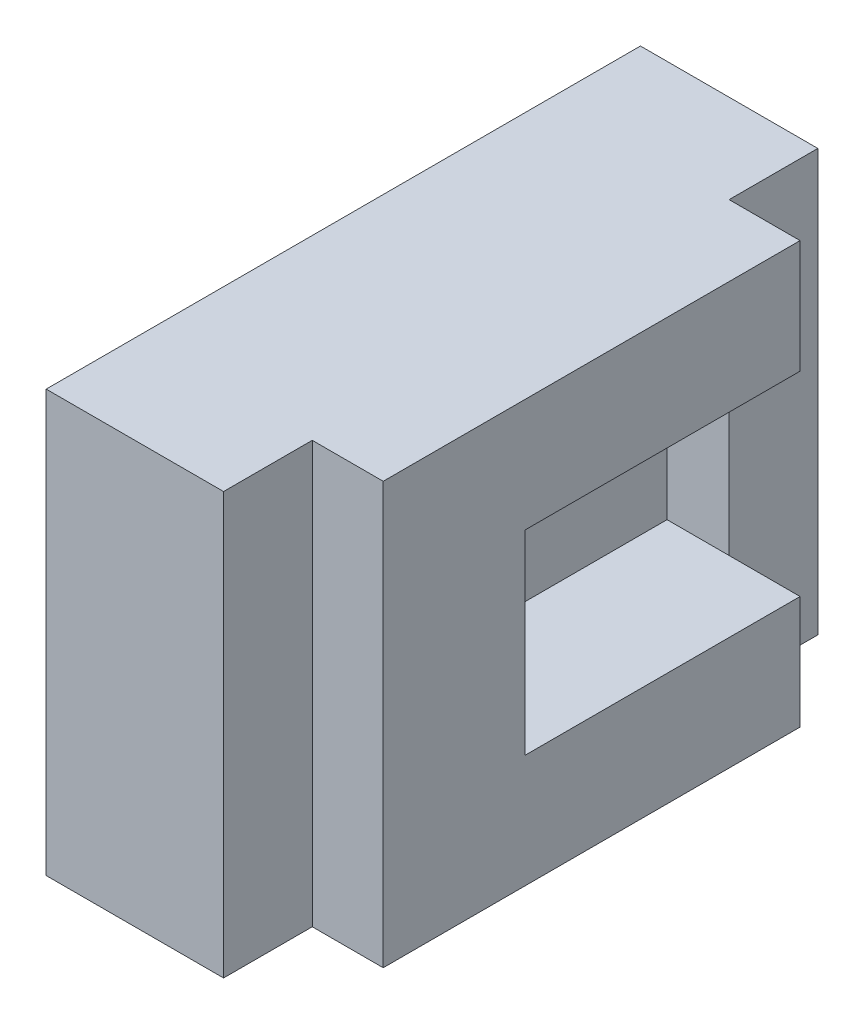
ISO-10303-21;
HEADER;
FILE_DESCRIPTION(('STEP AP214'),'2;1');
FILE_NAME('part.step','',(''),(''),'','','');
FILE_SCHEMA(('AUTOMOTIVE_DESIGN { 1 0 10303 214 1 1 1 1 }'));
ENDSEC;
DATA;
#1=APPLICATION_CONTEXT('core data for automotive mechanical design processes');
#2=APPLICATION_PROTOCOL_DEFINITION('international standard','automotive_design',2000,#1);
#3=PRODUCT_CONTEXT('',#1,'mechanical');
#4=PRODUCT('Part','Part','',(#3));
#5=PRODUCT_RELATED_PRODUCT_CATEGORY('part','',(#4));
#6=PRODUCT_DEFINITION_FORMATION('','',#4);
#7=PRODUCT_DEFINITION_CONTEXT('part definition',#1,'design');
#8=PRODUCT_DEFINITION('design','',#6,#7);
#9=PRODUCT_DEFINITION_SHAPE('','',#8);
#10=(LENGTH_UNIT() NAMED_UNIT(*) SI_UNIT(.MILLI.,.METRE.));
#11=(NAMED_UNIT(*) PLANE_ANGLE_UNIT() SI_UNIT($,.RADIAN.));
#12=(NAMED_UNIT(*) SI_UNIT($,.STERADIAN.) SOLID_ANGLE_UNIT());
#13=UNCERTAINTY_MEASURE_WITH_UNIT(LENGTH_MEASURE(1.E-05),#10,'distance_accuracy_value','');
#14=(GEOMETRIC_REPRESENTATION_CONTEXT(3) GLOBAL_UNCERTAINTY_ASSIGNED_CONTEXT((#13)) GLOBAL_UNIT_ASSIGNED_CONTEXT((#10,
#11,#12)) REPRESENTATION_CONTEXT('',''));
#15=CARTESIAN_POINT('',(0.,0.,0.));
#16=DIRECTION('',(0.,0.,1.));
#17=DIRECTION('',(1.,0.,0.));
#18=AXIS2_PLACEMENT_3D('',#15,#16,#17);
#19=CARTESIAN_POINT('',(28.,0.,0.));
#20=DIRECTION('',(0.,0.,-1.));
#21=DIRECTION('',(0.,1.,0.));
#22=AXIS2_PLACEMENT_3D('',#19,#20,#21);
#23=PLANE('',#22);
#24=DIRECTION('',(-1.,0.,0.));
#25=VECTOR('',#24,1.);
#26=CARTESIAN_POINT('',(28.,-47.5,0.));
#27=LINE('',#26,#25);
#28=CARTESIAN_POINT('',(20.,-47.5,0.));
#29=VERTEX_POINT('',#28);
#30=CARTESIAN_POINT('',(0.,-47.5,0.));
#31=VERTEX_POINT('',#30);
#32=EDGE_CURVE('E11',#29,#31,#27,.T.);
#33=ORIENTED_EDGE('',*,*,#32,.F.);
#34=DIRECTION('',(0.,-1.,0.));
#35=VECTOR('',#34,1.);
#36=CARTESIAN_POINT('',(20.,-47.5,0.));
#37=LINE('',#36,#35);
#38=CARTESIAN_POINT('',(20.,0.,0.));
#39=VERTEX_POINT('',#38);
#40=EDGE_CURVE('E127',#39,#29,#37,.T.);
#41=ORIENTED_EDGE('',*,*,#40,.F.);
#42=DIRECTION('',(-1.,0.,0.));
#43=VECTOR('',#42,1.);
#44=CARTESIAN_POINT('',(28.,0.,0.));
#45=LINE('',#44,#43);
#46=CARTESIAN_POINT('',(0.,0.,0.));
#47=VERTEX_POINT('',#46);
#48=EDGE_CURVE('E149',#39,#47,#45,.T.);
#49=ORIENTED_EDGE('',*,*,#48,.T.);
#50=DIRECTION('',(0.,-1.,0.));
#51=VECTOR('',#50,1.);
#52=CARTESIAN_POINT('',(0.,0.,0.));
#53=LINE('',#52,#51);
#54=EDGE_CURVE('E148',#47,#31,#53,.T.);
#55=ORIENTED_EDGE('',*,*,#54,.T.);
#56=EDGE_LOOP('',(#33,#41,#49,#55));
#57=FACE_BOUND('',#56,.T.);
#58=ADVANCED_FACE('F33',(#57),#23,.F.);
#59=CARTESIAN_POINT('',(28.,-47.5,0.));
#60=DIRECTION('',(0.,1.,0.));
#61=DIRECTION('',(0.,0.,1.));
#62=AXIS2_PLACEMENT_3D('',#59,#60,#61);
#63=PLANE('',#62);
#64=DIRECTION('',(0.,0.,-1.));
#65=VECTOR('',#64,1.);
#66=CARTESIAN_POINT('',(28.,-47.5,0.));
#67=LINE('',#66,#65);
#68=CARTESIAN_POINT('',(28.,-47.5,-10.));
#69=VERTEX_POINT('',#68);
#70=CARTESIAN_POINT('',(28.,-47.5,-57.));
#71=VERTEX_POINT('',#70);
#72=EDGE_CURVE('E168',#69,#71,#67,.T.);
#73=ORIENTED_EDGE('',*,*,#72,.F.);
#74=DIRECTION('',(1.,0.,0.));
#75=VECTOR('',#74,1.);
#76=CARTESIAN_POINT('',(20.,-47.5,-10.));
#77=LINE('',#76,#75);
#78=CARTESIAN_POINT('',(20.,-47.5,-10.));
#79=VERTEX_POINT('',#78);
#80=EDGE_CURVE('E47',#79,#69,#77,.T.);
#81=ORIENTED_EDGE('',*,*,#80,.F.);
#82=DIRECTION('',(0.,0.,-1.));
#83=VECTOR('',#82,1.);
#84=CARTESIAN_POINT('',(20.,-47.5,0.));
#85=LINE('',#84,#83);
#86=EDGE_CURVE('E131',#29,#79,#85,.T.);
#87=ORIENTED_EDGE('',*,*,#86,.F.);
#88=ORIENTED_EDGE('',*,*,#32,.T.);
#89=DIRECTION('',(0.,0.,-1.));
#90=VECTOR('',#89,1.);
#91=CARTESIAN_POINT('',(0.,-47.5,0.));
#92=LINE('',#91,#90);
#93=CARTESIAN_POINT('',(0.,-47.5,-67.));
#94=VERTEX_POINT('',#93);
#95=EDGE_CURVE('E153',#31,#94,#92,.T.);
#96=ORIENTED_EDGE('',*,*,#95,.T.);
#97=DIRECTION('',(-1.,0.,0.));
#98=VECTOR('',#97,1.);
#99=CARTESIAN_POINT('',(28.,-47.5,-67.));
#100=LINE('',#99,#98);
#101=CARTESIAN_POINT('',(20.,-47.5,-67.));
#102=VERTEX_POINT('',#101);
#103=EDGE_CURVE('E40',#102,#94,#100,.T.);
#104=ORIENTED_EDGE('',*,*,#103,.F.);
#105=DIRECTION('',(0.,0.,-1.));
#106=VECTOR('',#105,1.);
#107=CARTESIAN_POINT('',(20.,-47.5,-67.));
#108=LINE('',#107,#106);
#109=CARTESIAN_POINT('',(20.,-47.5,-57.));
#110=VERTEX_POINT('',#109);
#111=EDGE_CURVE('E196',#110,#102,#108,.T.);
#112=ORIENTED_EDGE('',*,*,#111,.F.);
#113=DIRECTION('',(1.,0.,0.));
#114=VECTOR('',#113,1.);
#115=CARTESIAN_POINT('',(20.,-47.5,-57.));
#116=LINE('',#115,#114);
#117=EDGE_CURVE('E200',#110,#71,#116,.T.);
#118=ORIENTED_EDGE('',*,*,#117,.T.);
#119=EDGE_LOOP('',(#73,#81,#87,#88,#96,#104,#112,#118));
#120=FACE_BOUND('',#119,.T.);
#121=ADVANCED_FACE('F141',(#120),#63,.F.);
#122=CARTESIAN_POINT('',(28.,0.,-67.));
#123=DIRECTION('',(0.,0.,1.));
#124=DIRECTION('',(1.,0.,0.));
#125=AXIS2_PLACEMENT_3D('',#122,#123,#124);
#126=PLANE('',#125);
#127=DIRECTION('',(-1.,0.,0.));
#128=VECTOR('',#127,1.);
#129=CARTESIAN_POINT('',(28.,0.,-67.));
#130=LINE('',#129,#128);
#131=CARTESIAN_POINT('',(20.,0.,-67.));
#132=VERTEX_POINT('',#131);
#133=CARTESIAN_POINT('',(0.,0.,-67.));
#134=VERTEX_POINT('',#133);
#135=EDGE_CURVE('E170',#132,#134,#130,.T.);
#136=ORIENTED_EDGE('',*,*,#135,.F.);
#137=DIRECTION('',(0.,1.,0.));
#138=VECTOR('',#137,1.);
#139=CARTESIAN_POINT('',(20.,0.,-67.));
#140=LINE('',#139,#138);
#141=EDGE_CURVE('E177',#102,#132,#140,.T.);
#142=ORIENTED_EDGE('',*,*,#141,.F.);
#143=ORIENTED_EDGE('',*,*,#103,.T.);
#144=DIRECTION('',(0.,1.,0.));
#145=VECTOR('',#144,1.);
#146=CARTESIAN_POINT('',(0.,0.,-67.));
#147=LINE('',#146,#145);
#148=EDGE_CURVE('E156',#94,#134,#147,.T.);
#149=ORIENTED_EDGE('',*,*,#148,.T.);
#150=EDGE_LOOP('',(#136,#142,#143,#149));
#151=FACE_BOUND('',#150,.T.);
#152=ADVANCED_FACE('F175',(#151),#126,.F.);
#153=CARTESIAN_POINT('',(28.,0.,0.));
#154=DIRECTION('',(0.,-1.,0.));
#155=DIRECTION('',(0.,0.,-1.));
#156=AXIS2_PLACEMENT_3D('',#153,#154,#155);
#157=PLANE('',#156);
#158=DIRECTION('',(0.,0.,1.));
#159=VECTOR('',#158,1.);
#160=CARTESIAN_POINT('',(20.,0.,0.));
#161=LINE('',#160,#159);
#162=CARTESIAN_POINT('',(20.,0.,-10.));
#163=VERTEX_POINT('',#162);
#164=EDGE_CURVE('E133',#163,#39,#161,.T.);
#165=ORIENTED_EDGE('',*,*,#164,.F.);
#166=DIRECTION('',(1.,0.,0.));
#167=VECTOR('',#166,1.);
#168=CARTESIAN_POINT('',(20.,0.,-10.));
#169=LINE('',#168,#167);
#170=CARTESIAN_POINT('',(28.,0.,-10.));
#171=VERTEX_POINT('',#170);
#172=EDGE_CURVE('E208',#163,#171,#169,.T.);
#173=ORIENTED_EDGE('',*,*,#172,.T.);
#174=DIRECTION('',(0.,0.,1.));
#175=VECTOR('',#174,1.);
#176=CARTESIAN_POINT('',(28.,0.,0.));
#177=LINE('',#176,#175);
#178=CARTESIAN_POINT('',(28.,0.,-57.));
#179=VERTEX_POINT('',#178);
#180=EDGE_CURVE('E161',#179,#171,#177,.T.);
#181=ORIENTED_EDGE('',*,*,#180,.F.);
#182=DIRECTION('',(1.,0.,0.));
#183=VECTOR('',#182,1.);
#184=CARTESIAN_POINT('',(20.,0.,-57.));
#185=LINE('',#184,#183);
#186=CARTESIAN_POINT('',(20.,0.,-57.));
#187=VERTEX_POINT('',#186);
#188=EDGE_CURVE('E187',#187,#179,#185,.T.);
#189=ORIENTED_EDGE('',*,*,#188,.F.);
#190=DIRECTION('',(0.,0.,1.));
#191=VECTOR('',#190,1.);
#192=CARTESIAN_POINT('',(20.,0.,-67.));
#193=LINE('',#192,#191);
#194=EDGE_CURVE('E185',#132,#187,#193,.T.);
#195=ORIENTED_EDGE('',*,*,#194,.F.);
#196=ORIENTED_EDGE('',*,*,#135,.T.);
#197=DIRECTION('',(0.,0.,1.));
#198=VECTOR('',#197,1.);
#199=CARTESIAN_POINT('',(0.,0.,0.));
#200=LINE('',#199,#198);
#201=EDGE_CURVE('E166',#134,#47,#200,.T.);
#202=ORIENTED_EDGE('',*,*,#201,.T.);
#203=ORIENTED_EDGE('',*,*,#48,.F.);
#204=EDGE_LOOP('',(#165,#173,#181,#189,#195,#196,#202,#203));
#205=FACE_BOUND('',#204,.T.);
#206=ADVANCED_FACE('F181',(#205),#157,.F.);
#207=CARTESIAN_POINT('',(28.,0.,0.));
#208=DIRECTION('',(1.,0.,0.));
#209=DIRECTION('',(0.,0.,-1.));
#210=AXIS2_PLACEMENT_3D('',#207,#208,#209);
#211=PLANE('',#210);
#212=DIRECTION('',(0.,1.,0.));
#213=VECTOR('',#212,1.);
#214=CARTESIAN_POINT('',(28.,-47.5,-10.));
#215=LINE('',#214,#213);
#216=EDGE_CURVE('E137',#69,#171,#215,.T.);
#217=ORIENTED_EDGE('',*,*,#216,.F.);
#218=ORIENTED_EDGE('',*,*,#72,.T.);
#219=DIRECTION('',(0.,-1.,0.));
#220=VECTOR('',#219,1.);
#221=CARTESIAN_POINT('',(28.,0.,-57.));
#222=LINE('',#221,#220);
#223=CARTESIAN_POINT('',(28.,-34.75,-57.));
#224=VERTEX_POINT('',#223);
#225=EDGE_CURVE('E199',#224,#71,#222,.T.);
#226=ORIENTED_EDGE('',*,*,#225,.F.);
#227=DIRECTION('',(0.,0.,-1.));
#228=VECTOR('',#227,1.);
#229=CARTESIAN_POINT('',(28.,-34.75,-26.));
#230=LINE('',#229,#228);
#231=CARTESIAN_POINT('',(28.,-34.75,-26.));
#232=VERTEX_POINT('',#231);
#233=EDGE_CURVE('E224',#232,#224,#230,.T.);
#234=ORIENTED_EDGE('',*,*,#233,.F.);
#235=DIRECTION('',(0.,-1.,0.));
#236=VECTOR('',#235,1.);
#237=CARTESIAN_POINT('',(28.,-12.75,-26.));
#238=LINE('',#237,#236);
#239=CARTESIAN_POINT('',(28.,-12.75,-26.));
#240=VERTEX_POINT('',#239);
#241=EDGE_CURVE('E207',#240,#232,#238,.T.);
#242=ORIENTED_EDGE('',*,*,#241,.F.);
#243=DIRECTION('',(0.,0.,1.));
#244=VECTOR('',#243,1.);
#245=CARTESIAN_POINT('',(28.,-12.75,-26.));
#246=LINE('',#245,#244);
#247=CARTESIAN_POINT('',(28.,-12.75,-57.));
#248=VERTEX_POINT('',#247);
#249=EDGE_CURVE('E213',#248,#240,#246,.T.);
#250=ORIENTED_EDGE('',*,*,#249,.F.);
#251=EDGE_CURVE('E192',#179,#248,#222,.T.);
#252=ORIENTED_EDGE('',*,*,#251,.F.);
#253=ORIENTED_EDGE('',*,*,#180,.T.);
#254=EDGE_LOOP('',(#217,#218,#226,#234,#242,#250,#252,#253));
#255=FACE_BOUND('',#254,.T.);
#256=ADVANCED_FACE('F241',(#255),#211,.T.);
#257=CARTESIAN_POINT('',(0.,0.,0.));
#258=DIRECTION('',(1.,0.,0.));
#259=DIRECTION('',(0.,0.,-1.));
#260=AXIS2_PLACEMENT_3D('',#257,#258,#259);
#261=PLANE('',#260);
#262=ORIENTED_EDGE('',*,*,#54,.F.);
#263=ORIENTED_EDGE('',*,*,#201,.F.);
#264=ORIENTED_EDGE('',*,*,#148,.F.);
#265=ORIENTED_EDGE('',*,*,#95,.F.);
#266=EDGE_LOOP('',(#262,#263,#264,#265));
#267=FACE_BOUND('',#266,.T.);
#268=ADVANCED_FACE('F179',(#267),#261,.F.);
#269=CARTESIAN_POINT('',(13.,-12.75,-26.));
#270=DIRECTION('',(0.,0.,1.));
#271=DIRECTION('',(1.,0.,0.));
#272=AXIS2_PLACEMENT_3D('',#269,#270,#271);
#273=PLANE('',#272);
#274=ORIENTED_EDGE('',*,*,#241,.T.);
#275=DIRECTION('',(1.,0.,0.));
#276=VECTOR('',#275,1.);
#277=CARTESIAN_POINT('',(13.,-34.75,-26.));
#278=LINE('',#277,#276);
#279=CARTESIAN_POINT('',(13.,-34.75,-26.));
#280=VERTEX_POINT('',#279);
#281=EDGE_CURVE('E222',#280,#232,#278,.T.);
#282=ORIENTED_EDGE('',*,*,#281,.F.);
#283=DIRECTION('',(0.,-1.,0.));
#284=VECTOR('',#283,1.);
#285=CARTESIAN_POINT('',(13.,-12.75,-26.));
#286=LINE('',#285,#284);
#287=CARTESIAN_POINT('',(13.,-12.75,-26.));
#288=VERTEX_POINT('',#287);
#289=EDGE_CURVE('E209',#288,#280,#286,.T.);
#290=ORIENTED_EDGE('',*,*,#289,.F.);
#291=DIRECTION('',(1.,0.,0.));
#292=VECTOR('',#291,1.);
#293=CARTESIAN_POINT('',(13.,-12.75,-26.));
#294=LINE('',#293,#292);
#295=EDGE_CURVE('E154',#288,#240,#294,.T.);
#296=ORIENTED_EDGE('',*,*,#295,.T.);
#297=EDGE_LOOP('',(#274,#282,#290,#296));
#298=FACE_BOUND('',#297,.T.);
#299=ADVANCED_FACE('F272',(#298),#273,.F.);
#300=CARTESIAN_POINT('',(13.,-12.75,-26.));
#301=DIRECTION('',(0.,1.,0.));
#302=DIRECTION('',(0.,0.,1.));
#303=AXIS2_PLACEMENT_3D('',#300,#301,#302);
#304=PLANE('',#303);
#305=ORIENTED_EDGE('',*,*,#249,.T.);
#306=ORIENTED_EDGE('',*,*,#295,.F.);
#307=DIRECTION('',(0.,0.,1.));
#308=VECTOR('',#307,1.);
#309=CARTESIAN_POINT('',(13.,-12.75,-26.));
#310=LINE('',#309,#308);
#311=CARTESIAN_POINT('',(13.,-12.75,-57.));
#312=VERTEX_POINT('',#311);
#313=EDGE_CURVE('E219',#312,#288,#310,.T.);
#314=ORIENTED_EDGE('',*,*,#313,.F.);
#315=DIRECTION('',(1.,0.,0.));
#316=VECTOR('',#315,1.);
#317=CARTESIAN_POINT('',(13.,-12.75,-57.));
#318=LINE('',#317,#316);
#319=CARTESIAN_POINT('',(20.,-12.75,-57.));
#320=VERTEX_POINT('',#319);
#321=EDGE_CURVE('E158',#312,#320,#318,.T.);
#322=ORIENTED_EDGE('',*,*,#321,.T.);
#323=DIRECTION('',(1.,0.,0.));
#324=VECTOR('',#323,1.);
#325=CARTESIAN_POINT('',(13.,-12.75,-57.));
#326=LINE('',#325,#324);
#327=EDGE_CURVE('E204',#320,#248,#326,.T.);
#328=ORIENTED_EDGE('',*,*,#327,.T.);
#329=EDGE_LOOP('',(#305,#306,#314,#322,#328));
#330=FACE_BOUND('',#329,.T.);
#331=ADVANCED_FACE('F277',(#330),#304,.F.);
#332=CARTESIAN_POINT('',(13.,-12.75,-57.));
#333=DIRECTION('',(0.,0.,-1.));
#334=DIRECTION('',(-1.,0.,0.));
#335=AXIS2_PLACEMENT_3D('',#332,#333,#334);
#336=PLANE('',#335);
#337=DIRECTION('',(1.,0.,0.));
#338=VECTOR('',#337,1.);
#339=CARTESIAN_POINT('',(13.,-34.75,-57.));
#340=LINE('',#339,#338);
#341=CARTESIAN_POINT('',(13.,-34.75,-57.));
#342=VERTEX_POINT('',#341);
#343=CARTESIAN_POINT('',(20.,-34.75,-57.));
#344=VERTEX_POINT('',#343);
#345=EDGE_CURVE('E231',#342,#344,#340,.T.);
#346=ORIENTED_EDGE('',*,*,#345,.T.);
#347=DIRECTION('',(0.,-1.,0.));
#348=VECTOR('',#347,1.);
#349=CARTESIAN_POINT('',(20.,0.,-57.));
#350=LINE('',#349,#348);
#351=EDGE_CURVE('E55',#320,#344,#350,.T.);
#352=ORIENTED_EDGE('',*,*,#351,.F.);
#353=ORIENTED_EDGE('',*,*,#321,.F.);
#354=DIRECTION('',(0.,1.,0.));
#355=VECTOR('',#354,1.);
#356=CARTESIAN_POINT('',(13.,-12.75,-57.));
#357=LINE('',#356,#355);
#358=EDGE_CURVE('E216',#342,#312,#357,.T.);
#359=ORIENTED_EDGE('',*,*,#358,.F.);
#360=EDGE_LOOP('',(#346,#352,#353,#359));
#361=FACE_BOUND('',#360,.T.);
#362=ADVANCED_FACE('F283',(#361),#336,.F.);
#363=CARTESIAN_POINT('',(13.,-34.75,-26.));
#364=DIRECTION('',(0.,-1.,0.));
#365=DIRECTION('',(0.,0.,-1.));
#366=AXIS2_PLACEMENT_3D('',#363,#364,#365);
#367=PLANE('',#366);
#368=ORIENTED_EDGE('',*,*,#233,.T.);
#369=EDGE_CURVE('E234',#344,#224,#340,.T.);
#370=ORIENTED_EDGE('',*,*,#369,.F.);
#371=ORIENTED_EDGE('',*,*,#345,.F.);
#372=DIRECTION('',(0.,0.,-1.));
#373=VECTOR('',#372,1.);
#374=CARTESIAN_POINT('',(13.,-34.75,-26.));
#375=LINE('',#374,#373);
#376=EDGE_CURVE('E212',#280,#342,#375,.T.);
#377=ORIENTED_EDGE('',*,*,#376,.F.);
#378=ORIENTED_EDGE('',*,*,#281,.T.);
#379=EDGE_LOOP('',(#368,#370,#371,#377,#378));
#380=FACE_BOUND('',#379,.T.);
#381=ADVANCED_FACE('F279',(#380),#367,.F.);
#382=CARTESIAN_POINT('',(13.,0.,0.));
#383=DIRECTION('',(1.,0.,0.));
#384=DIRECTION('',(0.,0.,-1.));
#385=AXIS2_PLACEMENT_3D('',#382,#383,#384);
#386=PLANE('',#385);
#387=ORIENTED_EDGE('',*,*,#289,.T.);
#388=ORIENTED_EDGE('',*,*,#376,.T.);
#389=ORIENTED_EDGE('',*,*,#358,.T.);
#390=ORIENTED_EDGE('',*,*,#313,.T.);
#391=EDGE_LOOP('',(#387,#388,#389,#390));
#392=FACE_BOUND('',#391,.T.);
#393=ADVANCED_FACE('F282',(#392),#386,.T.);
#394=CARTESIAN_POINT('',(20.,0.,-57.));
#395=DIRECTION('',(0.,0.,1.));
#396=DIRECTION('',(0.,-1.,0.));
#397=AXIS2_PLACEMENT_3D('',#394,#395,#396);
#398=PLANE('',#397);
#399=EDGE_CURVE('E191',#187,#320,#350,.T.);
#400=ORIENTED_EDGE('',*,*,#399,.F.);
#401=ORIENTED_EDGE('',*,*,#188,.T.);
#402=ORIENTED_EDGE('',*,*,#251,.T.);
#403=ORIENTED_EDGE('',*,*,#327,.F.);
#404=EDGE_LOOP('',(#400,#401,#402,#403));
#405=FACE_BOUND('',#404,.T.);
#406=ADVANCED_FACE('F293',(#405),#398,.F.);
#407=ORIENTED_EDGE('',*,*,#225,.T.);
#408=ORIENTED_EDGE('',*,*,#117,.F.);
#409=EDGE_CURVE('E188',#344,#110,#350,.T.);
#410=ORIENTED_EDGE('',*,*,#409,.F.);
#411=ORIENTED_EDGE('',*,*,#369,.T.);
#412=EDGE_LOOP('',(#407,#408,#410,#411));
#413=FACE_BOUND('',#412,.T.);
#414=ADVANCED_FACE('F257',(#413),#398,.F.);
#415=CARTESIAN_POINT('',(20.,0.,0.));
#416=DIRECTION('',(-1.,0.,0.));
#417=DIRECTION('',(0.,0.,1.));
#418=AXIS2_PLACEMENT_3D('',#415,#416,#417);
#419=PLANE('',#418);
#420=ORIENTED_EDGE('',*,*,#141,.T.);
#421=ORIENTED_EDGE('',*,*,#194,.T.);
#422=ORIENTED_EDGE('',*,*,#399,.T.);
#423=ORIENTED_EDGE('',*,*,#351,.T.);
#424=ORIENTED_EDGE('',*,*,#409,.T.);
#425=ORIENTED_EDGE('',*,*,#111,.T.);
#426=EDGE_LOOP('',(#420,#421,#422,#423,#424,#425));
#427=FACE_BOUND('',#426,.T.);
#428=ADVANCED_FACE('F250',(#427),#419,.F.);
#429=CARTESIAN_POINT('',(20.,-47.5,-10.));
#430=DIRECTION('',(0.,0.,-1.));
#431=DIRECTION('',(0.,1.,0.));
#432=AXIS2_PLACEMENT_3D('',#429,#430,#431);
#433=PLANE('',#432);
#434=ORIENTED_EDGE('',*,*,#216,.T.);
#435=ORIENTED_EDGE('',*,*,#172,.F.);
#436=DIRECTION('',(0.,1.,0.));
#437=VECTOR('',#436,1.);
#438=CARTESIAN_POINT('',(20.,-47.5,-10.));
#439=LINE('',#438,#437);
#440=EDGE_CURVE('E144',#79,#163,#439,.T.);
#441=ORIENTED_EDGE('',*,*,#440,.F.);
#442=ORIENTED_EDGE('',*,*,#80,.T.);
#443=EDGE_LOOP('',(#434,#435,#441,#442));
#444=FACE_BOUND('',#443,.T.);
#445=ADVANCED_FACE('F248',(#444),#433,.F.);
#446=CARTESIAN_POINT('',(20.,0.,0.));
#447=DIRECTION('',(-1.,0.,0.));
#448=DIRECTION('',(0.,0.,1.));
#449=AXIS2_PLACEMENT_3D('',#446,#447,#448);
#450=PLANE('',#449);
#451=ORIENTED_EDGE('',*,*,#40,.T.);
#452=ORIENTED_EDGE('',*,*,#86,.T.);
#453=ORIENTED_EDGE('',*,*,#440,.T.);
#454=ORIENTED_EDGE('',*,*,#164,.T.);
#455=EDGE_LOOP('',(#451,#452,#453,#454));
#456=FACE_BOUND('',#455,.T.);
#457=ADVANCED_FACE('F129',(#456),#450,.F.);
#458=CLOSED_SHELL('',(#58,#121,#152,#206,#256,#268,#299,#331,#362,#381,#393,#406,#414,#428,#445,#457));
#459=MANIFOLD_SOLID_BREP('B2',#458);
#460=ADVANCED_BREP_SHAPE_REPRESENTATION('',(#18,#459),#14);
#461=SHAPE_DEFINITION_REPRESENTATION(#9,#460);
ENDSEC;
END-ISO-10303-21;
